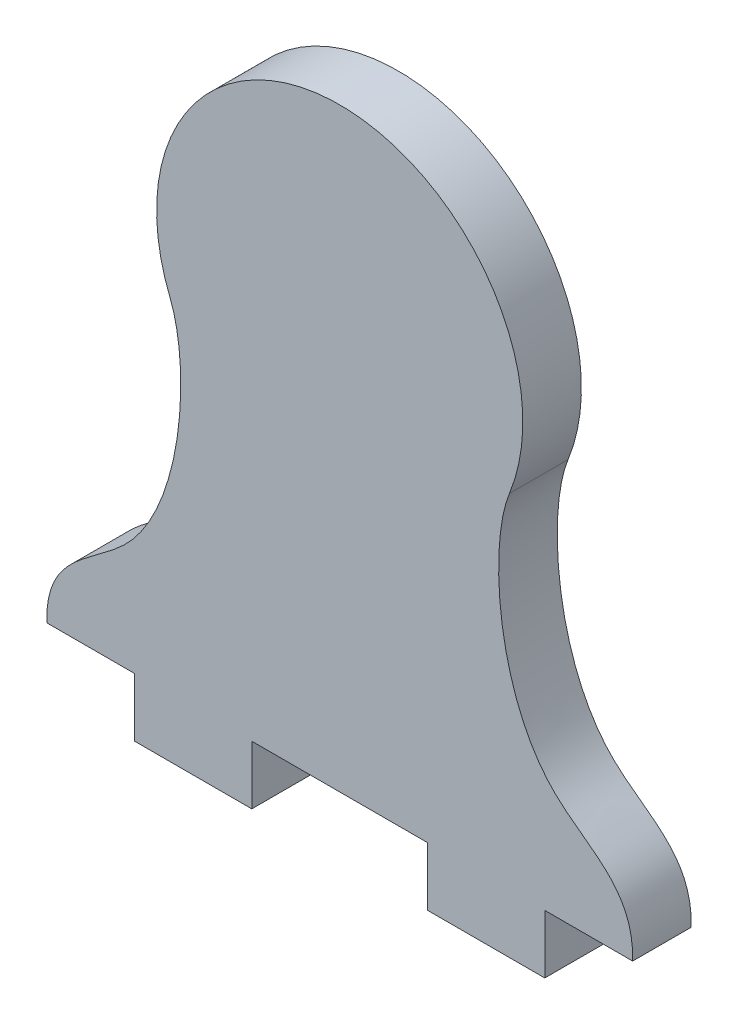
ISO-10303-21;
HEADER;
FILE_DESCRIPTION(('STEP AP214'),'2;1');
FILE_NAME('part.step','',(''),(''),'','','');
FILE_SCHEMA(('AUTOMOTIVE_DESIGN { 1 0 10303 214 1 1 1 1 }'));
ENDSEC;
DATA;
#1=APPLICATION_CONTEXT('core data for automotive mechanical design processes');
#2=APPLICATION_PROTOCOL_DEFINITION('international standard','automotive_design',2000,#1);
#3=PRODUCT_CONTEXT('',#1,'mechanical');
#4=PRODUCT('Part','Part','',(#3));
#5=PRODUCT_RELATED_PRODUCT_CATEGORY('part','',(#4));
#6=PRODUCT_DEFINITION_FORMATION('','',#4);
#7=PRODUCT_DEFINITION_CONTEXT('part definition',#1,'design');
#8=PRODUCT_DEFINITION('design','',#6,#7);
#9=PRODUCT_DEFINITION_SHAPE('','',#8);
#10=(LENGTH_UNIT() NAMED_UNIT(*) SI_UNIT(.MILLI.,.METRE.));
#11=(NAMED_UNIT(*) PLANE_ANGLE_UNIT() SI_UNIT($,.RADIAN.));
#12=(NAMED_UNIT(*) SI_UNIT($,.STERADIAN.) SOLID_ANGLE_UNIT());
#13=UNCERTAINTY_MEASURE_WITH_UNIT(LENGTH_MEASURE(1.E-05),#10,'distance_accuracy_value','');
#14=(GEOMETRIC_REPRESENTATION_CONTEXT(3) GLOBAL_UNCERTAINTY_ASSIGNED_CONTEXT((#13)) GLOBAL_UNIT_ASSIGNED_CONTEXT((#10,
#11,#12)) REPRESENTATION_CONTEXT('',''));
#15=CARTESIAN_POINT('',(0.,0.,0.));
#16=DIRECTION('',(0.,0.,1.));
#17=DIRECTION('',(1.,0.,0.));
#18=AXIS2_PLACEMENT_3D('',#15,#16,#17);
#19=CARTESIAN_POINT('',(0.,0.,4.));
#20=DIRECTION('',(0.,-1.,0.));
#21=DIRECTION('',(0.,0.,-1.));
#22=AXIS2_PLACEMENT_3D('',#19,#20,#21);
#23=PLANE('',#22);
#24=DIRECTION('',(-1.,0.,0.));
#25=VECTOR('',#24,1.);
#26=CARTESIAN_POINT('',(0.,0.,0.));
#27=LINE('',#26,#25);
#28=CARTESIAN_POINT('',(6.,0.,0.));
#29=VERTEX_POINT('',#28);
#30=CARTESIAN_POINT('',(-6.,0.,0.));
#31=VERTEX_POINT('',#30);
#32=EDGE_CURVE('E151',#29,#31,#27,.T.);
#33=ORIENTED_EDGE('',*,*,#32,.F.);
#34=DIRECTION('',(0.,0.,-1.));
#35=VECTOR('',#34,1.);
#36=CARTESIAN_POINT('',(6.,0.,4.));
#37=LINE('',#36,#35);
#38=CARTESIAN_POINT('',(6.,0.,4.));
#39=VERTEX_POINT('',#38);
#40=EDGE_CURVE('E11',#39,#29,#37,.T.);
#41=ORIENTED_EDGE('',*,*,#40,.F.);
#42=DIRECTION('',(-1.,0.,0.));
#43=VECTOR('',#42,1.);
#44=CARTESIAN_POINT('',(0.,0.,4.));
#45=LINE('',#44,#43);
#46=CARTESIAN_POINT('',(-6.,0.,4.));
#47=VERTEX_POINT('',#46);
#48=EDGE_CURVE('E190',#39,#47,#45,.T.);
#49=ORIENTED_EDGE('',*,*,#48,.T.);
#50=DIRECTION('',(0.,0.,-1.));
#51=VECTOR('',#50,1.);
#52=CARTESIAN_POINT('',(-6.,0.,4.));
#53=LINE('',#52,#51);
#54=EDGE_CURVE('E49',#47,#31,#53,.T.);
#55=ORIENTED_EDGE('',*,*,#54,.T.);
#56=EDGE_LOOP('',(#33,#41,#49,#55));
#57=FACE_BOUND('',#56,.T.);
#58=ADVANCED_FACE('F33',(#57),#23,.T.);
#59=CARTESIAN_POINT('',(6.,-28.4426655602145,4.));
#60=DIRECTION('',(1.,0.,0.));
#61=DIRECTION('',(0.,0.,-1.));
#62=AXIS2_PLACEMENT_3D('',#59,#60,#61);
#63=PLANE('',#62);
#64=DIRECTION('',(0.,-1.,0.));
#65=VECTOR('',#64,1.);
#66=CARTESIAN_POINT('',(6.,-28.4426655602145,0.));
#67=LINE('',#66,#65);
#68=CARTESIAN_POINT('',(6.,-4.,0.));
#69=VERTEX_POINT('',#68);
#70=EDGE_CURVE('E153',#29,#69,#67,.T.);
#71=ORIENTED_EDGE('',*,*,#70,.T.);
#72=DIRECTION('',(0.,0.,-1.));
#73=VECTOR('',#72,1.);
#74=CARTESIAN_POINT('',(6.,-4.,4.));
#75=LINE('',#74,#73);
#76=CARTESIAN_POINT('',(6.,-4.,4.));
#77=VERTEX_POINT('',#76);
#78=EDGE_CURVE('E41',#77,#69,#75,.T.);
#79=ORIENTED_EDGE('',*,*,#78,.F.);
#80=DIRECTION('',(0.,-1.,0.));
#81=VECTOR('',#80,1.);
#82=CARTESIAN_POINT('',(6.,-28.4426655602145,4.));
#83=LINE('',#82,#81);
#84=EDGE_CURVE('E232',#39,#77,#83,.T.);
#85=ORIENTED_EDGE('',*,*,#84,.F.);
#86=ORIENTED_EDGE('',*,*,#40,.T.);
#87=EDGE_LOOP('',(#71,#79,#85,#86));
#88=FACE_BOUND('',#87,.T.);
#89=ADVANCED_FACE('F260',(#88),#63,.F.);
#90=CARTESIAN_POINT('',(0.,-4.,4.));
#91=DIRECTION('',(0.,1.,0.));
#92=DIRECTION('',(-1.,0.,0.));
#93=AXIS2_PLACEMENT_3D('',#90,#91,#92);
#94=PLANE('',#93);
#95=DIRECTION('',(1.,0.,0.));
#96=VECTOR('',#95,1.);
#97=CARTESIAN_POINT('',(0.,-4.,0.));
#98=LINE('',#97,#96);
#99=CARTESIAN_POINT('',(14.,-4.,0.));
#100=VERTEX_POINT('',#99);
#101=EDGE_CURVE('E155',#69,#100,#98,.T.);
#102=ORIENTED_EDGE('',*,*,#101,.T.);
#103=DIRECTION('',(0.,0.,-1.));
#104=VECTOR('',#103,1.);
#105=CARTESIAN_POINT('',(14.,-4.,4.));
#106=LINE('',#105,#104);
#107=CARTESIAN_POINT('',(14.,-4.,4.));
#108=VERTEX_POINT('',#107);
#109=EDGE_CURVE('E206',#108,#100,#106,.T.);
#110=ORIENTED_EDGE('',*,*,#109,.F.);
#111=DIRECTION('',(1.,0.,0.));
#112=VECTOR('',#111,1.);
#113=CARTESIAN_POINT('',(0.,-4.,4.));
#114=LINE('',#113,#112);
#115=EDGE_CURVE('E214',#77,#108,#114,.T.);
#116=ORIENTED_EDGE('',*,*,#115,.F.);
#117=ORIENTED_EDGE('',*,*,#78,.T.);
#118=EDGE_LOOP('',(#102,#110,#116,#117));
#119=FACE_BOUND('',#118,.T.);
#120=ADVANCED_FACE('F212',(#119),#94,.F.);
#121=CARTESIAN_POINT('',(14.,-28.4426655602145,4.));
#122=DIRECTION('',(1.,0.,0.));
#123=DIRECTION('',(0.,0.,-1.));
#124=AXIS2_PLACEMENT_3D('',#121,#122,#123);
#125=PLANE('',#124);
#126=DIRECTION('',(0.,-1.,0.));
#127=VECTOR('',#126,1.);
#128=CARTESIAN_POINT('',(14.,-28.4426655602145,0.));
#129=LINE('',#128,#127);
#130=CARTESIAN_POINT('',(14.,0.,0.));
#131=VERTEX_POINT('',#130);
#132=EDGE_CURVE('E158',#131,#100,#129,.T.);
#133=ORIENTED_EDGE('',*,*,#132,.F.);
#134=DIRECTION('',(0.,0.,-1.));
#135=VECTOR('',#134,1.);
#136=CARTESIAN_POINT('',(14.,0.,4.));
#137=LINE('',#136,#135);
#138=CARTESIAN_POINT('',(14.,0.,4.));
#139=VERTEX_POINT('',#138);
#140=EDGE_CURVE('E204',#139,#131,#137,.T.);
#141=ORIENTED_EDGE('',*,*,#140,.F.);
#142=DIRECTION('',(0.,-1.,0.));
#143=VECTOR('',#142,1.);
#144=CARTESIAN_POINT('',(14.,-28.4426655602145,4.));
#145=LINE('',#144,#143);
#146=EDGE_CURVE('E227',#139,#108,#145,.T.);
#147=ORIENTED_EDGE('',*,*,#146,.T.);
#148=ORIENTED_EDGE('',*,*,#109,.T.);
#149=EDGE_LOOP('',(#133,#141,#147,#148));
#150=FACE_BOUND('',#149,.T.);
#151=ADVANCED_FACE('F223',(#150),#125,.T.);
#152=CARTESIAN_POINT('',(0.,0.,4.));
#153=DIRECTION('',(0.,1.,0.));
#154=DIRECTION('',(-1.,0.,0.));
#155=AXIS2_PLACEMENT_3D('',#152,#153,#154);
#156=PLANE('',#155);
#157=DIRECTION('',(1.,0.,0.));
#158=VECTOR('',#157,1.);
#159=CARTESIAN_POINT('',(0.,0.,0.));
#160=LINE('',#159,#158);
#161=CARTESIAN_POINT('',(20.,0.,0.));
#162=VERTEX_POINT('',#161);
#163=EDGE_CURVE('E161',#131,#162,#160,.T.);
#164=ORIENTED_EDGE('',*,*,#163,.T.);
#165=DIRECTION('',(0.,0.,-1.));
#166=VECTOR('',#165,1.);
#167=CARTESIAN_POINT('',(20.,0.,4.));
#168=LINE('',#167,#166);
#169=CARTESIAN_POINT('',(20.,0.,4.));
#170=VERTEX_POINT('',#169);
#171=EDGE_CURVE('E201',#170,#162,#168,.T.);
#172=ORIENTED_EDGE('',*,*,#171,.F.);
#173=DIRECTION('',(1.,0.,0.));
#174=VECTOR('',#173,1.);
#175=CARTESIAN_POINT('',(0.,0.,4.));
#176=LINE('',#175,#174);
#177=EDGE_CURVE('E228',#139,#170,#176,.T.);
#178=ORIENTED_EDGE('',*,*,#177,.F.);
#179=ORIENTED_EDGE('',*,*,#140,.T.);
#180=EDGE_LOOP('',(#164,#172,#178,#179));
#181=FACE_BOUND('',#180,.T.);
#182=ADVANCED_FACE('F251',(#181),#156,.F.);
#183=CARTESIAN_POINT('',(20.,0.,4.));
#184=CARTESIAN_POINT('',(20.1199091266344,4.31449858511505,4.));
#185=CARTESIAN_POINT('',(10.8687158536312,6.60315314527678,4.));
#186=CARTESIAN_POINT('',(10.1760352174909,19.9677561498633,4.));
#187=CARTESIAN_POINT('',(11.5828505524017,23.4321729241263,4.));
#188=CARTESIAN_POINT('',(11.5877830273503,23.4441792633606,4.));
#189=B_SPLINE_CURVE_WITH_KNOTS('',3,(#183,#184,#185,#186,#187,#188),.UNSPECIFIED.,.F.,.F.,(4,1,
1,4),(0.,0.21780514400852,0.603787585593846,0.60513354927344),.UNSPECIFIED.);
#190=DIRECTION('',(0.,0.,-1.));
#191=VECTOR('',#190,1.);
#192=SURFACE_OF_LINEAR_EXTRUSION('',#189,#191);
#193=CARTESIAN_POINT('',(20.,0.,0.));
#194=CARTESIAN_POINT('',(20.1199091266344,4.31449858511505,0.));
#195=CARTESIAN_POINT('',(10.8687158536312,6.60315314527678,0.));
#196=CARTESIAN_POINT('',(10.1760352174909,19.9677561498633,0.));
#197=CARTESIAN_POINT('',(11.5828505524017,23.4321729241263,0.));
#198=CARTESIAN_POINT('',(11.5877830273503,23.4441792633606,0.));
#199=B_SPLINE_CURVE_WITH_KNOTS('',3,(#193,#194,#195,#196,#197,#198),.UNSPECIFIED.,.F.,.F.,(4,1,
1,4),(0.,0.21780514400852,0.603787585593846,0.60513354927344),.UNSPECIFIED.);
#200=CARTESIAN_POINT('',(11.5877830273502,23.4441792633606,0.));
#201=VERTEX_POINT('',#200);
#202=EDGE_CURVE('E163',#162,#201,#199,.T.);
#203=ORIENTED_EDGE('',*,*,#202,.T.);
#204=DIRECTION('',(0.,0.,-1.));
#205=VECTOR('',#204,1.);
#206=CARTESIAN_POINT('',(11.5877830273502,23.4441792633606,4.));
#207=LINE('',#206,#205);
#208=CARTESIAN_POINT('',(11.5877830273502,23.4441792633606,4.));
#209=VERTEX_POINT('',#208);
#210=EDGE_CURVE('E198',#209,#201,#207,.T.);
#211=ORIENTED_EDGE('',*,*,#210,.F.);
#212=EDGE_CURVE('E230',#170,#209,#189,.T.);
#213=ORIENTED_EDGE('',*,*,#212,.F.);
#214=ORIENTED_EDGE('',*,*,#171,.T.);
#215=EDGE_LOOP('',(#203,#211,#213,#214));
#216=FACE_BOUND('',#215,.T.);
#217=ADVANCED_FACE('F246',(#216),#192,.F.);
#218=CARTESIAN_POINT('',(0.,28.1317462773939,4.));
#219=DIRECTION('',(0.,0.,-1.));
#220=DIRECTION('',(-1.,0.,0.));
#221=AXIS2_PLACEMENT_3D('',#218,#219,#220);
#222=CYLINDRICAL_SURFACE('',#221,12.4999999999999);
#223=CARTESIAN_POINT('',(0.,28.1317462773939,0.));
#224=DIRECTION('',(0.,0.,1.));
#225=DIRECTION('',(1.,0.,0.));
#226=AXIS2_PLACEMENT_3D('',#223,#224,#225);
#227=CIRCLE('',#226,12.4999999999999);
#228=CARTESIAN_POINT('',(-11.5877830273502,23.4441792633606,0.));
#229=VERTEX_POINT('',#228);
#230=EDGE_CURVE('E167',#201,#229,#227,.T.);
#231=ORIENTED_EDGE('',*,*,#230,.T.);
#232=DIRECTION('',(0.,0.,-1.));
#233=VECTOR('',#232,1.);
#234=CARTESIAN_POINT('',(-11.5877830273502,23.4441792633606,4.));
#235=LINE('',#234,#233);
#236=CARTESIAN_POINT('',(-11.5877830273502,23.4441792633606,4.));
#237=VERTEX_POINT('',#236);
#238=EDGE_CURVE('E196',#237,#229,#235,.T.);
#239=ORIENTED_EDGE('',*,*,#238,.F.);
#240=CARTESIAN_POINT('',(0.,28.1317462773939,4.));
#241=DIRECTION('',(0.,0.,1.));
#242=DIRECTION('',(1.,0.,0.));
#243=AXIS2_PLACEMENT_3D('',#240,#241,#242);
#244=CIRCLE('',#243,12.4999999999999);
#245=EDGE_CURVE('E240',#209,#237,#244,.T.);
#246=ORIENTED_EDGE('',*,*,#245,.F.);
#247=ORIENTED_EDGE('',*,*,#210,.T.);
#248=EDGE_LOOP('',(#231,#239,#246,#247));
#249=FACE_BOUND('',#248,.T.);
#250=ADVANCED_FACE('F250',(#249),#222,.T.);
#251=CARTESIAN_POINT('',(-20.,0.,4.));
#252=CARTESIAN_POINT('',(-20.1199091266344,4.31449858511505,4.));
#253=CARTESIAN_POINT('',(-10.8687158536312,6.60315314527678,4.));
#254=CARTESIAN_POINT('',(-10.1760352174909,19.9677561498633,4.));
#255=CARTESIAN_POINT('',(-11.5828505524017,23.4321729241263,4.));
#256=CARTESIAN_POINT('',(-11.5877830273503,23.4441792633606,4.));
#257=B_SPLINE_CURVE_WITH_KNOTS('',3,(#251,#252,#253,#254,#255,#256),.UNSPECIFIED.,.F.,.F.,(4,1,
1,4),(0.,0.21780514400852,0.603787585593846,0.60513354927344),.UNSPECIFIED.);
#258=DIRECTION('',(0.,0.,-1.));
#259=VECTOR('',#258,1.);
#260=SURFACE_OF_LINEAR_EXTRUSION('',#257,#259);
#261=CARTESIAN_POINT('',(-20.,0.,0.));
#262=CARTESIAN_POINT('',(-20.1199091266344,4.31449858511505,0.));
#263=CARTESIAN_POINT('',(-10.8687158536312,6.60315314527678,0.));
#264=CARTESIAN_POINT('',(-10.1760352174909,19.9677561498633,0.));
#265=CARTESIAN_POINT('',(-11.5828505524017,23.4321729241263,0.));
#266=CARTESIAN_POINT('',(-11.5877830273503,23.4441792633606,0.));
#267=B_SPLINE_CURVE_WITH_KNOTS('',3,(#261,#262,#263,#264,#265,#266),.UNSPECIFIED.,.F.,.F.,(4,1,
1,4),(0.,0.21780514400852,0.603787585593846,0.60513354927344),.UNSPECIFIED.);
#268=CARTESIAN_POINT('',(-20.,0.,0.));
#269=VERTEX_POINT('',#268);
#270=EDGE_CURVE('E173',#269,#229,#267,.T.);
#271=ORIENTED_EDGE('',*,*,#270,.F.);
#272=DIRECTION('',(0.,0.,-1.));
#273=VECTOR('',#272,1.);
#274=CARTESIAN_POINT('',(-20.,0.,4.));
#275=LINE('',#274,#273);
#276=CARTESIAN_POINT('',(-20.,0.,4.));
#277=VERTEX_POINT('',#276);
#278=EDGE_CURVE('E194',#277,#269,#275,.T.);
#279=ORIENTED_EDGE('',*,*,#278,.F.);
#280=EDGE_CURVE('E285',#277,#237,#257,.T.);
#281=ORIENTED_EDGE('',*,*,#280,.T.);
#282=ORIENTED_EDGE('',*,*,#238,.T.);
#283=EDGE_LOOP('',(#271,#279,#281,#282));
#284=FACE_BOUND('',#283,.T.);
#285=ADVANCED_FACE('F281',(#284),#260,.T.);
#286=CARTESIAN_POINT('',(0.,0.,4.));
#287=DIRECTION('',(0.,-1.,0.));
#288=DIRECTION('',(1.,0.,0.));
#289=AXIS2_PLACEMENT_3D('',#286,#287,#288);
#290=PLANE('',#289);
#291=DIRECTION('',(-1.,0.,0.));
#292=VECTOR('',#291,1.);
#293=CARTESIAN_POINT('',(0.,0.,0.));
#294=LINE('',#293,#292);
#295=CARTESIAN_POINT('',(-14.,0.,0.));
#296=VERTEX_POINT('',#295);
#297=EDGE_CURVE('E178',#296,#269,#294,.T.);
#298=ORIENTED_EDGE('',*,*,#297,.F.);
#299=DIRECTION('',(0.,0.,-1.));
#300=VECTOR('',#299,1.);
#301=CARTESIAN_POINT('',(-14.,0.,4.));
#302=LINE('',#301,#300);
#303=CARTESIAN_POINT('',(-14.,0.,4.));
#304=VERTEX_POINT('',#303);
#305=EDGE_CURVE('E143',#304,#296,#302,.T.);
#306=ORIENTED_EDGE('',*,*,#305,.F.);
#307=DIRECTION('',(-1.,0.,0.));
#308=VECTOR('',#307,1.);
#309=CARTESIAN_POINT('',(0.,0.,4.));
#310=LINE('',#309,#308);
#311=EDGE_CURVE('E133',#304,#277,#310,.T.);
#312=ORIENTED_EDGE('',*,*,#311,.T.);
#313=ORIENTED_EDGE('',*,*,#278,.T.);
#314=EDGE_LOOP('',(#298,#306,#312,#313));
#315=FACE_BOUND('',#314,.T.);
#316=ADVANCED_FACE('F279',(#315),#290,.T.);
#317=CARTESIAN_POINT('',(-14.,-28.4426655602145,4.));
#318=DIRECTION('',(1.,0.,0.));
#319=DIRECTION('',(0.,0.,-1.));
#320=AXIS2_PLACEMENT_3D('',#317,#318,#319);
#321=PLANE('',#320);
#322=DIRECTION('',(0.,-1.,0.));
#323=VECTOR('',#322,1.);
#324=CARTESIAN_POINT('',(-14.,-28.4426655602145,0.));
#325=LINE('',#324,#323);
#326=CARTESIAN_POINT('',(-14.,-4.,0.));
#327=VERTEX_POINT('',#326);
#328=EDGE_CURVE('E140',#296,#327,#325,.T.);
#329=ORIENTED_EDGE('',*,*,#328,.T.);
#330=DIRECTION('',(0.,0.,-1.));
#331=VECTOR('',#330,1.);
#332=CARTESIAN_POINT('',(-14.,-4.,4.));
#333=LINE('',#332,#331);
#334=CARTESIAN_POINT('',(-14.,-4.,4.));
#335=VERTEX_POINT('',#334);
#336=EDGE_CURVE('E137',#335,#327,#333,.T.);
#337=ORIENTED_EDGE('',*,*,#336,.F.);
#338=DIRECTION('',(0.,-1.,0.));
#339=VECTOR('',#338,1.);
#340=CARTESIAN_POINT('',(-14.,-28.4426655602145,4.));
#341=LINE('',#340,#339);
#342=EDGE_CURVE('E124',#304,#335,#341,.T.);
#343=ORIENTED_EDGE('',*,*,#342,.F.);
#344=ORIENTED_EDGE('',*,*,#305,.T.);
#345=EDGE_LOOP('',(#329,#337,#343,#344));
#346=FACE_BOUND('',#345,.T.);
#347=ADVANCED_FACE('F138',(#346),#321,.F.);
#348=CARTESIAN_POINT('',(0.,-4.,4.));
#349=DIRECTION('',(0.,-1.,0.));
#350=DIRECTION('',(1.,0.,0.));
#351=AXIS2_PLACEMENT_3D('',#348,#349,#350);
#352=PLANE('',#351);
#353=DIRECTION('',(-1.,0.,0.));
#354=VECTOR('',#353,1.);
#355=CARTESIAN_POINT('',(0.,-4.,0.));
#356=LINE('',#355,#354);
#357=CARTESIAN_POINT('',(-6.,-4.,0.));
#358=VERTEX_POINT('',#357);
#359=EDGE_CURVE('E185',#358,#327,#356,.T.);
#360=ORIENTED_EDGE('',*,*,#359,.F.);
#361=DIRECTION('',(0.,0.,-1.));
#362=VECTOR('',#361,1.);
#363=CARTESIAN_POINT('',(-6.,-4.,4.));
#364=LINE('',#363,#362);
#365=CARTESIAN_POINT('',(-6.,-4.,4.));
#366=VERTEX_POINT('',#365);
#367=EDGE_CURVE('E86',#366,#358,#364,.T.);
#368=ORIENTED_EDGE('',*,*,#367,.F.);
#369=DIRECTION('',(-1.,0.,0.));
#370=VECTOR('',#369,1.);
#371=CARTESIAN_POINT('',(0.,-4.,4.));
#372=LINE('',#371,#370);
#373=EDGE_CURVE('E130',#366,#335,#372,.T.);
#374=ORIENTED_EDGE('',*,*,#373,.T.);
#375=ORIENTED_EDGE('',*,*,#336,.T.);
#376=EDGE_LOOP('',(#360,#368,#374,#375));
#377=FACE_BOUND('',#376,.T.);
#378=ADVANCED_FACE('F145',(#377),#352,.T.);
#379=CARTESIAN_POINT('',(-6.,-28.4426655602145,4.));
#380=DIRECTION('',(1.,0.,0.));
#381=DIRECTION('',(0.,0.,-1.));
#382=AXIS2_PLACEMENT_3D('',#379,#380,#381);
#383=PLANE('',#382);
#384=DIRECTION('',(0.,-1.,0.));
#385=VECTOR('',#384,1.);
#386=CARTESIAN_POINT('',(-6.,-28.4426655602145,0.));
#387=LINE('',#386,#385);
#388=EDGE_CURVE('E187',#31,#358,#387,.T.);
#389=ORIENTED_EDGE('',*,*,#388,.F.);
#390=ORIENTED_EDGE('',*,*,#54,.F.);
#391=DIRECTION('',(0.,-1.,0.));
#392=VECTOR('',#391,1.);
#393=CARTESIAN_POINT('',(-6.,-28.4426655602145,4.));
#394=LINE('',#393,#392);
#395=EDGE_CURVE('E146',#47,#366,#394,.T.);
#396=ORIENTED_EDGE('',*,*,#395,.T.);
#397=ORIENTED_EDGE('',*,*,#367,.T.);
#398=EDGE_LOOP('',(#389,#390,#396,#397));
#399=FACE_BOUND('',#398,.T.);
#400=ADVANCED_FACE('F266',(#399),#383,.T.);
#401=CARTESIAN_POINT('',(0.,-28.4426655602145,4.));
#402=DIRECTION('',(0.,0.,1.));
#403=DIRECTION('',(1.,0.,0.));
#404=AXIS2_PLACEMENT_3D('',#401,#402,#403);
#405=PLANE('',#404);
#406=ORIENTED_EDGE('',*,*,#48,.F.);
#407=ORIENTED_EDGE('',*,*,#84,.T.);
#408=ORIENTED_EDGE('',*,*,#115,.T.);
#409=ORIENTED_EDGE('',*,*,#146,.F.);
#410=ORIENTED_EDGE('',*,*,#177,.T.);
#411=ORIENTED_EDGE('',*,*,#212,.T.);
#412=ORIENTED_EDGE('',*,*,#245,.T.);
#413=ORIENTED_EDGE('',*,*,#280,.F.);
#414=ORIENTED_EDGE('',*,*,#311,.F.);
#415=ORIENTED_EDGE('',*,*,#342,.T.);
#416=ORIENTED_EDGE('',*,*,#373,.F.);
#417=ORIENTED_EDGE('',*,*,#395,.F.);
#418=EDGE_LOOP('',(#406,#407,#408,#409,#410,#411,#412,#413,#414,#415,#416,#417));
#419=FACE_BOUND('',#418,.T.);
#420=ADVANCED_FACE('F127',(#419),#405,.T.);
#421=CARTESIAN_POINT('',(0.,-28.4426655602145,0.));
#422=DIRECTION('',(0.,0.,1.));
#423=DIRECTION('',(1.,0.,0.));
#424=AXIS2_PLACEMENT_3D('',#421,#422,#423);
#425=PLANE('',#424);
#426=ORIENTED_EDGE('',*,*,#32,.T.);
#427=ORIENTED_EDGE('',*,*,#388,.T.);
#428=ORIENTED_EDGE('',*,*,#359,.T.);
#429=ORIENTED_EDGE('',*,*,#328,.F.);
#430=ORIENTED_EDGE('',*,*,#297,.T.);
#431=ORIENTED_EDGE('',*,*,#270,.T.);
#432=ORIENTED_EDGE('',*,*,#230,.F.);
#433=ORIENTED_EDGE('',*,*,#202,.F.);
#434=ORIENTED_EDGE('',*,*,#163,.F.);
#435=ORIENTED_EDGE('',*,*,#132,.T.);
#436=ORIENTED_EDGE('',*,*,#101,.F.);
#437=ORIENTED_EDGE('',*,*,#70,.F.);
#438=EDGE_LOOP('',(#426,#427,#428,#429,#430,#431,#432,#433,#434,#435,#436,#437));
#439=FACE_BOUND('',#438,.T.);
#440=ADVANCED_FACE('F218',(#439),#425,.F.);
#441=CLOSED_SHELL('',(#58,#89,#120,#151,#182,#217,#250,#285,#316,#347,#378,#400,#420,#440));
#442=MANIFOLD_SOLID_BREP('B2',#441);
#443=ADVANCED_BREP_SHAPE_REPRESENTATION('',(#18,#442),#14);
#444=SHAPE_DEFINITION_REPRESENTATION(#9,#443);
ENDSEC;
END-ISO-10303-21;
